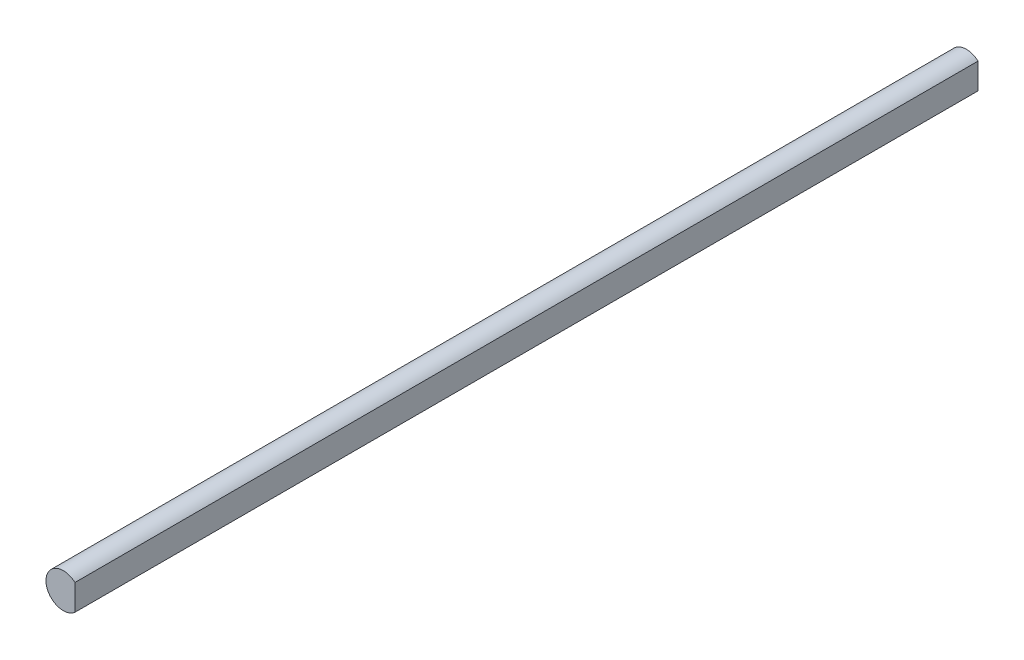
ISO-10303-21;
HEADER;
FILE_DESCRIPTION(('STEP AP214'),'2;1');
FILE_NAME('part.step','',(''),(''),'','','');
FILE_SCHEMA(('AUTOMOTIVE_DESIGN { 1 0 10303 214 1 1 1 1 }'));
ENDSEC;
DATA;
#1=APPLICATION_CONTEXT('core data for automotive mechanical design processes');
#2=APPLICATION_PROTOCOL_DEFINITION('international standard','automotive_design',2000,#1);
#3=PRODUCT_CONTEXT('',#1,'mechanical');
#4=PRODUCT('Part','Part','',(#3));
#5=PRODUCT_RELATED_PRODUCT_CATEGORY('part','',(#4));
#6=PRODUCT_DEFINITION_FORMATION('','',#4);
#7=PRODUCT_DEFINITION_CONTEXT('part definition',#1,'design');
#8=PRODUCT_DEFINITION('design','',#6,#7);
#9=PRODUCT_DEFINITION_SHAPE('','',#8);
#10=(LENGTH_UNIT() NAMED_UNIT(*) SI_UNIT(.MILLI.,.METRE.));
#11=(NAMED_UNIT(*) PLANE_ANGLE_UNIT() SI_UNIT($,.RADIAN.));
#12=(NAMED_UNIT(*) SI_UNIT($,.STERADIAN.) SOLID_ANGLE_UNIT());
#13=UNCERTAINTY_MEASURE_WITH_UNIT(LENGTH_MEASURE(1.E-05),#10,'distance_accuracy_value','');
#14=(GEOMETRIC_REPRESENTATION_CONTEXT(3) GLOBAL_UNCERTAINTY_ASSIGNED_CONTEXT((#13)) GLOBAL_UNIT_ASSIGNED_CONTEXT((#10,
#11,#12)) REPRESENTATION_CONTEXT('',''));
#15=CARTESIAN_POINT('',(0.,0.,0.));
#16=DIRECTION('',(0.,0.,1.));
#17=DIRECTION('',(1.,0.,0.));
#18=AXIS2_PLACEMENT_3D('',#15,#16,#17);
#19=CARTESIAN_POINT('',(0.,0.,130.));
#20=DIRECTION('',(0.,0.,-1.));
#21=DIRECTION('',(-1.,0.,0.));
#22=AXIS2_PLACEMENT_3D('',#19,#20,#21);
#23=CYLINDRICAL_SURFACE('',#22,2.5);
#24=CARTESIAN_POINT('',(0.,0.,130.));
#25=DIRECTION('',(0.,0.,1.));
#26=DIRECTION('',(1.,0.,0.));
#27=AXIS2_PLACEMENT_3D('',#24,#25,#26);
#28=CIRCLE('',#27,2.5);
#29=CARTESIAN_POINT('',(1.67291040295499,1.85778652801795,130.));
#30=VERTEX_POINT('',#29);
#31=CARTESIAN_POINT('',(1.67291040295499,-1.85778652801795,130.));
#32=VERTEX_POINT('',#31);
#33=EDGE_CURVE('E11',#30,#32,#28,.T.);
#34=ORIENTED_EDGE('',*,*,#33,.F.);
#35=DIRECTION('',(0.,0.,-1.));
#36=VECTOR('',#35,1.);
#37=CARTESIAN_POINT('',(1.67291040295499,1.85778652801795,130.));
#38=LINE('',#37,#36);
#39=CARTESIAN_POINT('',(1.67291040295499,1.85778652801795,0.));
#40=VERTEX_POINT('',#39);
#41=EDGE_CURVE('E66',#30,#40,#38,.T.);
#42=ORIENTED_EDGE('',*,*,#41,.T.);
#43=CARTESIAN_POINT('',(0.,0.,0.));
#44=DIRECTION('',(0.,0.,1.));
#45=DIRECTION('',(1.,0.,0.));
#46=AXIS2_PLACEMENT_3D('',#43,#44,#45);
#47=CIRCLE('',#46,2.5);
#48=CARTESIAN_POINT('',(1.67291040295499,-1.85778652801795,0.));
#49=VERTEX_POINT('',#48);
#50=EDGE_CURVE('E48',#40,#49,#47,.T.);
#51=ORIENTED_EDGE('',*,*,#50,.T.);
#52=DIRECTION('',(0.,0.,-1.));
#53=VECTOR('',#52,1.);
#54=CARTESIAN_POINT('',(1.67291040295499,-1.85778652801795,130.));
#55=LINE('',#54,#53);
#56=EDGE_CURVE('E60',#32,#49,#55,.T.);
#57=ORIENTED_EDGE('',*,*,#56,.F.);
#58=EDGE_LOOP('',(#34,#42,#51,#57));
#59=FACE_BOUND('',#58,.T.);
#60=ADVANCED_FACE('F45',(#59),#23,.T.);
#61=CARTESIAN_POINT('',(0.,0.,130.));
#62=DIRECTION('',(0.,0.,1.));
#63=DIRECTION('',(1.,0.,0.));
#64=AXIS2_PLACEMENT_3D('',#61,#62,#63);
#65=PLANE('',#64);
#66=DIRECTION('',(0.,1.,0.));
#67=VECTOR('',#66,1.);
#68=CARTESIAN_POINT('',(1.67291040295499,1.85778652801795,130.));
#69=LINE('',#68,#67);
#70=EDGE_CURVE('E76',#32,#30,#69,.T.);
#71=ORIENTED_EDGE('',*,*,#70,.T.);
#72=ORIENTED_EDGE('',*,*,#33,.T.);
#73=EDGE_LOOP('',(#71,#72));
#74=FACE_BOUND('',#73,.T.);
#75=ADVANCED_FACE('F89',(#74),#65,.T.);
#76=CARTESIAN_POINT('',(0.,0.,0.));
#77=DIRECTION('',(0.,0.,1.));
#78=DIRECTION('',(1.,0.,0.));
#79=AXIS2_PLACEMENT_3D('',#76,#77,#78);
#80=PLANE('',#79);
#81=ORIENTED_EDGE('',*,*,#50,.F.);
#82=DIRECTION('',(0.,1.,0.));
#83=VECTOR('',#82,1.);
#84=CARTESIAN_POINT('',(1.67291040295499,1.85778652801795,0.));
#85=LINE('',#84,#83);
#86=EDGE_CURVE('E70',#49,#40,#85,.T.);
#87=ORIENTED_EDGE('',*,*,#86,.F.);
#88=EDGE_LOOP('',(#81,#87));
#89=FACE_BOUND('',#88,.T.);
#90=ADVANCED_FACE('F82',(#89),#80,.F.);
#91=CARTESIAN_POINT('',(1.67291040295499,1.85778652801795,130.));
#92=DIRECTION('',(-1.,0.,0.));
#93=DIRECTION('',(0.,0.,1.));
#94=AXIS2_PLACEMENT_3D('',#91,#92,#93);
#95=PLANE('',#94);
#96=ORIENTED_EDGE('',*,*,#86,.T.);
#97=ORIENTED_EDGE('',*,*,#41,.F.);
#98=ORIENTED_EDGE('',*,*,#70,.F.);
#99=ORIENTED_EDGE('',*,*,#56,.T.);
#100=EDGE_LOOP('',(#96,#97,#98,#99));
#101=FACE_BOUND('',#100,.T.);
#102=ADVANCED_FACE('F71',(#101),#95,.F.);
#103=CLOSED_SHELL('',(#60,#75,#90,#102));
#104=MANIFOLD_SOLID_BREP('B2',#103);
#105=ADVANCED_BREP_SHAPE_REPRESENTATION('',(#18,#104),#14);
#106=SHAPE_DEFINITION_REPRESENTATION(#9,#105);
ENDSEC;
END-ISO-10303-21;
